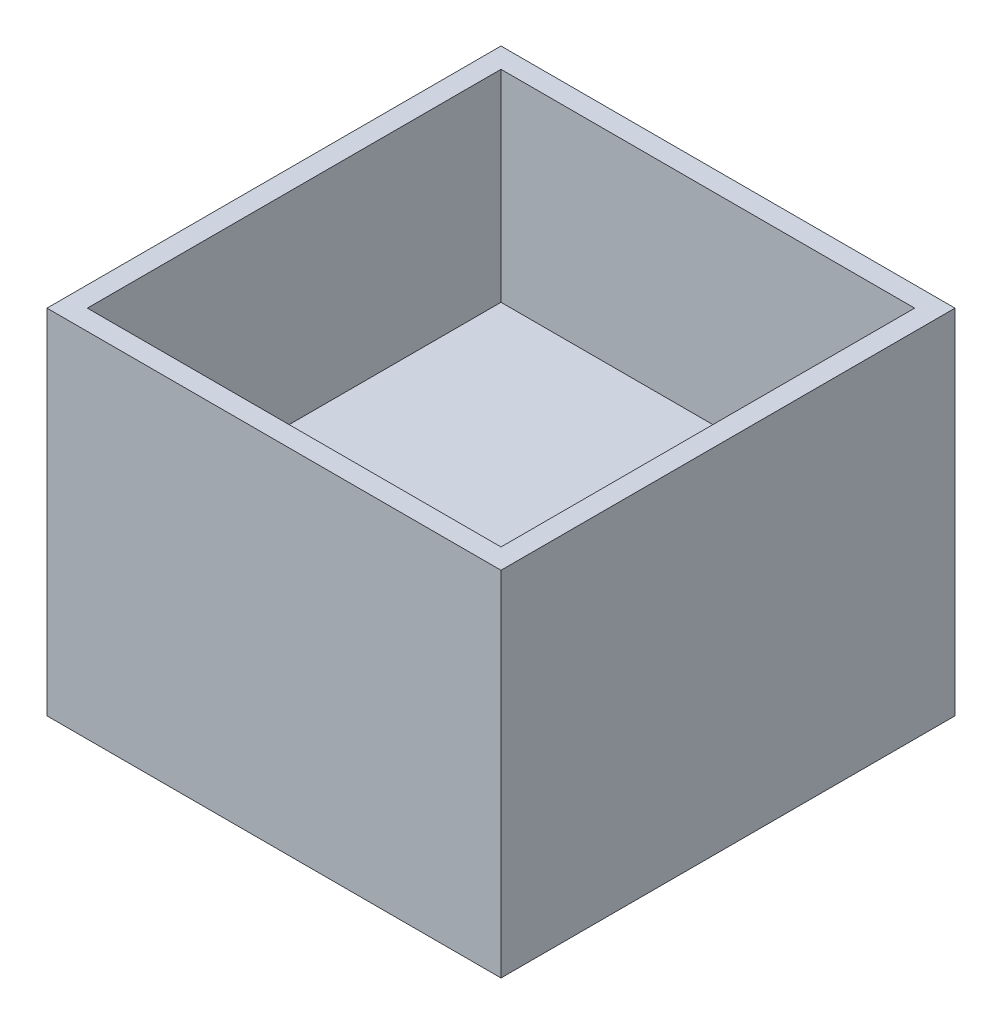
ISO-10303-21;
HEADER;
FILE_DESCRIPTION(('STEP AP214'),'2;1');
FILE_NAME('part.step','',(''),(''),'','','');
FILE_SCHEMA(('AUTOMOTIVE_DESIGN { 1 0 10303 214 1 1 1 1 }'));
ENDSEC;
DATA;
#1=APPLICATION_CONTEXT('core data for automotive mechanical design processes');
#2=APPLICATION_PROTOCOL_DEFINITION('international standard','automotive_design',2000,#1);
#3=PRODUCT_CONTEXT('',#1,'mechanical');
#4=PRODUCT('Part','Part','',(#3));
#5=PRODUCT_RELATED_PRODUCT_CATEGORY('part','',(#4));
#6=PRODUCT_DEFINITION_FORMATION('','',#4);
#7=PRODUCT_DEFINITION_CONTEXT('part definition',#1,'design');
#8=PRODUCT_DEFINITION('design','',#6,#7);
#9=PRODUCT_DEFINITION_SHAPE('','',#8);
#10=(LENGTH_UNIT() NAMED_UNIT(*) SI_UNIT(.MILLI.,.METRE.));
#11=(NAMED_UNIT(*) PLANE_ANGLE_UNIT() SI_UNIT($,.RADIAN.));
#12=(NAMED_UNIT(*) SI_UNIT($,.STERADIAN.) SOLID_ANGLE_UNIT());
#13=UNCERTAINTY_MEASURE_WITH_UNIT(LENGTH_MEASURE(1.E-05),#10,'distance_accuracy_value','');
#14=(GEOMETRIC_REPRESENTATION_CONTEXT(3) GLOBAL_UNCERTAINTY_ASSIGNED_CONTEXT((#13)) GLOBAL_UNIT_ASSIGNED_CONTEXT((#10,
#11,#12)) REPRESENTATION_CONTEXT('',''));
#15=CARTESIAN_POINT('',(0.,0.,0.));
#16=DIRECTION('',(0.,0.,1.));
#17=DIRECTION('',(1.,0.,0.));
#18=AXIS2_PLACEMENT_3D('',#15,#16,#17);
#19=CARTESIAN_POINT('',(0.,35.,0.));
#20=DIRECTION('',(1.,0.,0.));
#21=DIRECTION('',(0.,0.,-1.));
#22=AXIS2_PLACEMENT_3D('',#19,#20,#21);
#23=PLANE('',#22);
#24=DIRECTION('',(0.,0.,1.));
#25=VECTOR('',#24,1.);
#26=CARTESIAN_POINT('',(0.,0.,0.));
#27=LINE('',#26,#25);
#28=CARTESIAN_POINT('',(0.,0.,-45.));
#29=VERTEX_POINT('',#28);
#30=CARTESIAN_POINT('',(0.,0.,0.));
#31=VERTEX_POINT('',#30);
#32=EDGE_CURVE('E158',#29,#31,#27,.T.);
#33=ORIENTED_EDGE('',*,*,#32,.T.);
#34=DIRECTION('',(0.,-1.,0.));
#35=VECTOR('',#34,1.);
#36=CARTESIAN_POINT('',(0.,35.,0.));
#37=LINE('',#36,#35);
#38=CARTESIAN_POINT('',(0.,35.,0.));
#39=VERTEX_POINT('',#38);
#40=EDGE_CURVE('E11',#39,#31,#37,.T.);
#41=ORIENTED_EDGE('',*,*,#40,.F.);
#42=DIRECTION('',(0.,0.,1.));
#43=VECTOR('',#42,1.);
#44=CARTESIAN_POINT('',(0.,35.,0.));
#45=LINE('',#44,#43);
#46=CARTESIAN_POINT('',(0.,35.,-45.));
#47=VERTEX_POINT('',#46);
#48=EDGE_CURVE('E164',#47,#39,#45,.T.);
#49=ORIENTED_EDGE('',*,*,#48,.F.);
#50=DIRECTION('',(0.,-1.,0.));
#51=VECTOR('',#50,1.);
#52=CARTESIAN_POINT('',(0.,35.,-45.));
#53=LINE('',#52,#51);
#54=EDGE_CURVE('E174',#47,#29,#53,.T.);
#55=ORIENTED_EDGE('',*,*,#54,.T.);
#56=EDGE_LOOP('',(#33,#41,#49,#55));
#57=FACE_BOUND('',#56,.T.);
#58=ADVANCED_FACE('F39',(#57),#23,.F.);
#59=CARTESIAN_POINT('',(0.,35.,0.));
#60=DIRECTION('',(0.,0.,-1.));
#61=DIRECTION('',(-1.,0.,0.));
#62=AXIS2_PLACEMENT_3D('',#59,#60,#61);
#63=PLANE('',#62);
#64=DIRECTION('',(1.,0.,0.));
#65=VECTOR('',#64,1.);
#66=CARTESIAN_POINT('',(0.,0.,0.));
#67=LINE('',#66,#65);
#68=CARTESIAN_POINT('',(45.,0.,0.));
#69=VERTEX_POINT('',#68);
#70=EDGE_CURVE('E178',#31,#69,#67,.T.);
#71=ORIENTED_EDGE('',*,*,#70,.T.);
#72=DIRECTION('',(0.,-1.,0.));
#73=VECTOR('',#72,1.);
#74=CARTESIAN_POINT('',(45.,35.,0.));
#75=LINE('',#74,#73);
#76=CARTESIAN_POINT('',(45.,35.,0.));
#77=VERTEX_POINT('',#76);
#78=EDGE_CURVE('E47',#77,#69,#75,.T.);
#79=ORIENTED_EDGE('',*,*,#78,.F.);
#80=DIRECTION('',(1.,0.,0.));
#81=VECTOR('',#80,1.);
#82=CARTESIAN_POINT('',(0.,35.,0.));
#83=LINE('',#82,#81);
#84=EDGE_CURVE('E91',#39,#77,#83,.T.);
#85=ORIENTED_EDGE('',*,*,#84,.F.);
#86=ORIENTED_EDGE('',*,*,#40,.T.);
#87=EDGE_LOOP('',(#71,#79,#85,#86));
#88=FACE_BOUND('',#87,.T.);
#89=ADVANCED_FACE('F213',(#88),#63,.F.);
#90=CARTESIAN_POINT('',(45.,35.,0.));
#91=DIRECTION('',(-1.,0.,0.));
#92=DIRECTION('',(0.,0.,1.));
#93=AXIS2_PLACEMENT_3D('',#90,#91,#92);
#94=PLANE('',#93);
#95=DIRECTION('',(0.,0.,-1.));
#96=VECTOR('',#95,1.);
#97=CARTESIAN_POINT('',(45.,0.,0.));
#98=LINE('',#97,#96);
#99=CARTESIAN_POINT('',(45.,0.,-45.));
#100=VERTEX_POINT('',#99);
#101=EDGE_CURVE('E181',#69,#100,#98,.T.);
#102=ORIENTED_EDGE('',*,*,#101,.T.);
#103=DIRECTION('',(0.,-1.,0.));
#104=VECTOR('',#103,1.);
#105=CARTESIAN_POINT('',(45.,35.,-45.));
#106=LINE('',#105,#104);
#107=CARTESIAN_POINT('',(45.,35.,-45.));
#108=VERTEX_POINT('',#107);
#109=EDGE_CURVE('E188',#108,#100,#106,.T.);
#110=ORIENTED_EDGE('',*,*,#109,.F.);
#111=DIRECTION('',(0.,0.,-1.));
#112=VECTOR('',#111,1.);
#113=CARTESIAN_POINT('',(45.,35.,0.));
#114=LINE('',#113,#112);
#115=EDGE_CURVE('E169',#77,#108,#114,.T.);
#116=ORIENTED_EDGE('',*,*,#115,.F.);
#117=ORIENTED_EDGE('',*,*,#78,.T.);
#118=EDGE_LOOP('',(#102,#110,#116,#117));
#119=FACE_BOUND('',#118,.T.);
#120=ADVANCED_FACE('F195',(#119),#94,.F.);
#121=CARTESIAN_POINT('',(0.,35.,-45.));
#122=DIRECTION('',(0.,0.,1.));
#123=DIRECTION('',(1.,0.,0.));
#124=AXIS2_PLACEMENT_3D('',#121,#122,#123);
#125=PLANE('',#124);
#126=DIRECTION('',(-1.,0.,0.));
#127=VECTOR('',#126,1.);
#128=CARTESIAN_POINT('',(0.,0.,-45.));
#129=LINE('',#128,#127);
#130=EDGE_CURVE('E84',#100,#29,#129,.T.);
#131=ORIENTED_EDGE('',*,*,#130,.T.);
#132=ORIENTED_EDGE('',*,*,#54,.F.);
#133=DIRECTION('',(-1.,0.,0.));
#134=VECTOR('',#133,1.);
#135=CARTESIAN_POINT('',(0.,35.,-45.));
#136=LINE('',#135,#134);
#137=EDGE_CURVE('E63',#108,#47,#136,.T.);
#138=ORIENTED_EDGE('',*,*,#137,.F.);
#139=ORIENTED_EDGE('',*,*,#109,.T.);
#140=EDGE_LOOP('',(#131,#132,#138,#139));
#141=FACE_BOUND('',#140,.T.);
#142=ADVANCED_FACE('F203',(#141),#125,.F.);
#143=CARTESIAN_POINT('',(0.,35.,0.));
#144=DIRECTION('',(0.,-1.,0.));
#145=DIRECTION('',(0.,0.,-1.));
#146=AXIS2_PLACEMENT_3D('',#143,#144,#145);
#147=PLANE('',#146);
#148=DIRECTION('',(1.,0.,0.));
#149=VECTOR('',#148,1.);
#150=CARTESIAN_POINT('',(43.,35.,-2.));
#151=LINE('',#150,#149);
#152=CARTESIAN_POINT('',(1.99999999999999,35.,-1.99999999999999));
#153=VERTEX_POINT('',#152);
#154=CARTESIAN_POINT('',(43.,35.,-2.));
#155=VERTEX_POINT('',#154);
#156=EDGE_CURVE('E149',#153,#155,#151,.T.);
#157=ORIENTED_EDGE('',*,*,#156,.F.);
#158=DIRECTION('',(0.,0.,1.));
#159=VECTOR('',#158,1.);
#160=CARTESIAN_POINT('',(1.99999999999999,35.,-1.99999999999999));
#161=LINE('',#160,#159);
#162=CARTESIAN_POINT('',(1.99999999999999,35.,-43.));
#163=VERTEX_POINT('',#162);
#164=EDGE_CURVE('E54',#163,#153,#161,.T.);
#165=ORIENTED_EDGE('',*,*,#164,.F.);
#166=DIRECTION('',(-1.,0.,0.));
#167=VECTOR('',#166,1.);
#168=CARTESIAN_POINT('',(1.99999999999999,35.,-43.));
#169=LINE('',#168,#167);
#170=CARTESIAN_POINT('',(43.,35.,-43.));
#171=VERTEX_POINT('',#170);
#172=EDGE_CURVE('E136',#171,#163,#169,.T.);
#173=ORIENTED_EDGE('',*,*,#172,.F.);
#174=DIRECTION('',(0.,0.,-1.));
#175=VECTOR('',#174,1.);
#176=CARTESIAN_POINT('',(43.,35.,-43.));
#177=LINE('',#176,#175);
#178=EDGE_CURVE('E140',#155,#171,#177,.T.);
#179=ORIENTED_EDGE('',*,*,#178,.F.);
#180=EDGE_LOOP('',(#157,#165,#173,#179));
#181=FACE_BOUND('',#180,.T.);
#182=ORIENTED_EDGE('',*,*,#48,.T.);
#183=ORIENTED_EDGE('',*,*,#84,.T.);
#184=ORIENTED_EDGE('',*,*,#115,.T.);
#185=ORIENTED_EDGE('',*,*,#137,.T.);
#186=EDGE_LOOP('',(#182,#183,#184,#185));
#187=FACE_BOUND('',#186,.T.);
#188=ADVANCED_FACE('F205',(#181,#187),#147,.F.);
#189=CARTESIAN_POINT('',(0.,0.,0.));
#190=DIRECTION('',(0.,-1.,0.));
#191=DIRECTION('',(0.,0.,-1.));
#192=AXIS2_PLACEMENT_3D('',#189,#190,#191);
#193=PLANE('',#192);
#194=ORIENTED_EDGE('',*,*,#32,.F.);
#195=ORIENTED_EDGE('',*,*,#130,.F.);
#196=ORIENTED_EDGE('',*,*,#101,.F.);
#197=ORIENTED_EDGE('',*,*,#70,.F.);
#198=EDGE_LOOP('',(#194,#195,#196,#197));
#199=FACE_BOUND('',#198,.T.);
#200=ADVANCED_FACE('F199',(#199),#193,.T.);
#201=CARTESIAN_POINT('',(1.99999999999999,15.,-1.99999999999999));
#202=DIRECTION('',(-1.,0.,0.));
#203=DIRECTION('',(0.,0.,1.));
#204=AXIS2_PLACEMENT_3D('',#201,#202,#203);
#205=PLANE('',#204);
#206=ORIENTED_EDGE('',*,*,#164,.T.);
#207=DIRECTION('',(0.,1.,0.));
#208=VECTOR('',#207,1.);
#209=CARTESIAN_POINT('',(1.99999999999999,15.,-1.99999999999999));
#210=LINE('',#209,#208);
#211=CARTESIAN_POINT('',(1.99999999999999,15.,-1.99999999999999));
#212=VERTEX_POINT('',#211);
#213=EDGE_CURVE('E111',#212,#153,#210,.T.);
#214=ORIENTED_EDGE('',*,*,#213,.F.);
#215=DIRECTION('',(0.,0.,1.));
#216=VECTOR('',#215,1.);
#217=CARTESIAN_POINT('',(1.99999999999999,15.,-1.99999999999999));
#218=LINE('',#217,#216);
#219=CARTESIAN_POINT('',(1.99999999999999,15.,-43.));
#220=VERTEX_POINT('',#219);
#221=EDGE_CURVE('E115',#220,#212,#218,.T.);
#222=ORIENTED_EDGE('',*,*,#221,.F.);
#223=DIRECTION('',(0.,1.,0.));
#224=VECTOR('',#223,1.);
#225=CARTESIAN_POINT('',(1.99999999999999,15.,-43.));
#226=LINE('',#225,#224);
#227=EDGE_CURVE('E155',#220,#163,#226,.T.);
#228=ORIENTED_EDGE('',*,*,#227,.T.);
#229=EDGE_LOOP('',(#206,#214,#222,#228));
#230=FACE_BOUND('',#229,.T.);
#231=ADVANCED_FACE('F113',(#230),#205,.F.);
#232=CARTESIAN_POINT('',(1.99999999999999,15.,-43.));
#233=DIRECTION('',(0.,0.,-1.));
#234=DIRECTION('',(-1.,0.,0.));
#235=AXIS2_PLACEMENT_3D('',#232,#233,#234);
#236=PLANE('',#235);
#237=ORIENTED_EDGE('',*,*,#172,.T.);
#238=ORIENTED_EDGE('',*,*,#227,.F.);
#239=DIRECTION('',(-1.,0.,0.));
#240=VECTOR('',#239,1.);
#241=CARTESIAN_POINT('',(1.99999999999999,15.,-43.));
#242=LINE('',#241,#240);
#243=CARTESIAN_POINT('',(43.,15.,-43.));
#244=VERTEX_POINT('',#243);
#245=EDGE_CURVE('E122',#244,#220,#242,.T.);
#246=ORIENTED_EDGE('',*,*,#245,.F.);
#247=DIRECTION('',(0.,1.,0.));
#248=VECTOR('',#247,1.);
#249=CARTESIAN_POINT('',(43.,15.,-43.));
#250=LINE('',#249,#248);
#251=EDGE_CURVE('E159',#244,#171,#250,.T.);
#252=ORIENTED_EDGE('',*,*,#251,.T.);
#253=EDGE_LOOP('',(#237,#238,#246,#252));
#254=FACE_BOUND('',#253,.T.);
#255=ADVANCED_FACE('F252',(#254),#236,.F.);
#256=CARTESIAN_POINT('',(43.,15.,-43.));
#257=DIRECTION('',(1.,0.,0.));
#258=DIRECTION('',(0.,0.,-1.));
#259=AXIS2_PLACEMENT_3D('',#256,#257,#258);
#260=PLANE('',#259);
#261=ORIENTED_EDGE('',*,*,#178,.T.);
#262=ORIENTED_EDGE('',*,*,#251,.F.);
#263=DIRECTION('',(0.,0.,-1.));
#264=VECTOR('',#263,1.);
#265=CARTESIAN_POINT('',(43.,15.,-43.));
#266=LINE('',#265,#264);
#267=CARTESIAN_POINT('',(43.,15.,-2.));
#268=VERTEX_POINT('',#267);
#269=EDGE_CURVE('E131',#268,#244,#266,.T.);
#270=ORIENTED_EDGE('',*,*,#269,.F.);
#271=DIRECTION('',(0.,1.,0.));
#272=VECTOR('',#271,1.);
#273=CARTESIAN_POINT('',(43.,15.,-2.));
#274=LINE('',#273,#272);
#275=EDGE_CURVE('E121',#268,#155,#274,.T.);
#276=ORIENTED_EDGE('',*,*,#275,.T.);
#277=EDGE_LOOP('',(#261,#262,#270,#276));
#278=FACE_BOUND('',#277,.T.);
#279=ADVANCED_FACE('F261',(#278),#260,.F.);
#280=CARTESIAN_POINT('',(43.,15.,-2.));
#281=DIRECTION('',(0.,0.,1.));
#282=DIRECTION('',(1.,0.,0.));
#283=AXIS2_PLACEMENT_3D('',#280,#281,#282);
#284=PLANE('',#283);
#285=ORIENTED_EDGE('',*,*,#156,.T.);
#286=ORIENTED_EDGE('',*,*,#275,.F.);
#287=DIRECTION('',(1.,0.,0.));
#288=VECTOR('',#287,1.);
#289=CARTESIAN_POINT('',(43.,15.,-2.));
#290=LINE('',#289,#288);
#291=EDGE_CURVE('E125',#212,#268,#290,.T.);
#292=ORIENTED_EDGE('',*,*,#291,.F.);
#293=ORIENTED_EDGE('',*,*,#213,.T.);
#294=EDGE_LOOP('',(#285,#286,#292,#293));
#295=FACE_BOUND('',#294,.T.);
#296=ADVANCED_FACE('F126',(#295),#284,.F.);
#297=CARTESIAN_POINT('',(0.,15.,0.));
#298=DIRECTION('',(0.,-1.,0.));
#299=DIRECTION('',(0.,0.,-1.));
#300=AXIS2_PLACEMENT_3D('',#297,#298,#299);
#301=PLANE('',#300);
#302=ORIENTED_EDGE('',*,*,#221,.T.);
#303=ORIENTED_EDGE('',*,*,#291,.T.);
#304=ORIENTED_EDGE('',*,*,#269,.T.);
#305=ORIENTED_EDGE('',*,*,#245,.T.);
#306=EDGE_LOOP('',(#302,#303,#304,#305));
#307=FACE_BOUND('',#306,.T.);
#308=ADVANCED_FACE('F133',(#307),#301,.F.);
#309=CLOSED_SHELL('',(#58,#89,#120,#142,#188,#200,#231,#255,#279,#296,#308));
#310=MANIFOLD_SOLID_BREP('B2',#309);
#311=ADVANCED_BREP_SHAPE_REPRESENTATION('',(#18,#310),#14);
#312=SHAPE_DEFINITION_REPRESENTATION(#9,#311);
ENDSEC;
END-ISO-10303-21;
